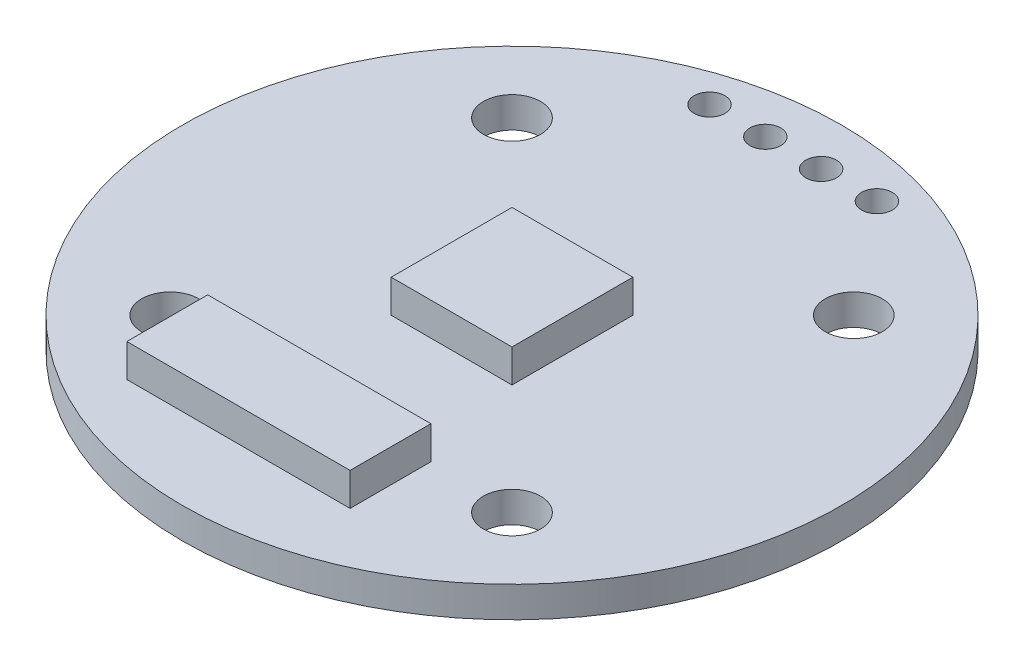
ISO-10303-21;
HEADER;
FILE_DESCRIPTION(('STEP AP214'),'2;1');
FILE_NAME('part.step','',(''),(''),'','','');
FILE_SCHEMA(('AUTOMOTIVE_DESIGN { 1 0 10303 214 1 1 1 1 }'));
ENDSEC;
DATA;
#1=APPLICATION_CONTEXT('core data for automotive mechanical design processes');
#2=APPLICATION_PROTOCOL_DEFINITION('international standard','automotive_design',2000,#1);
#3=PRODUCT_CONTEXT('',#1,'mechanical');
#4=PRODUCT('Part','Part','',(#3));
#5=PRODUCT_RELATED_PRODUCT_CATEGORY('part','',(#4));
#6=PRODUCT_DEFINITION_FORMATION('','',#4);
#7=PRODUCT_DEFINITION_CONTEXT('part definition',#1,'design');
#8=PRODUCT_DEFINITION('design','',#6,#7);
#9=PRODUCT_DEFINITION_SHAPE('','',#8);
#10=(LENGTH_UNIT() NAMED_UNIT(*) SI_UNIT(.MILLI.,.METRE.));
#11=(NAMED_UNIT(*) PLANE_ANGLE_UNIT() SI_UNIT($,.RADIAN.));
#12=(NAMED_UNIT(*) SI_UNIT($,.STERADIAN.) SOLID_ANGLE_UNIT());
#13=UNCERTAINTY_MEASURE_WITH_UNIT(LENGTH_MEASURE(1.E-05),#10,'distance_accuracy_value','');
#14=(GEOMETRIC_REPRESENTATION_CONTEXT(3) GLOBAL_UNCERTAINTY_ASSIGNED_CONTEXT((#13)) GLOBAL_UNIT_ASSIGNED_CONTEXT((#10,
#11,#12)) REPRESENTATION_CONTEXT('',''));
#15=CARTESIAN_POINT('',(0.,0.,0.));
#16=DIRECTION('',(0.,0.,1.));
#17=DIRECTION('',(1.,0.,0.));
#18=AXIS2_PLACEMENT_3D('',#15,#16,#17);
#19=CARTESIAN_POINT('',(7.77817459305198,1.4,-7.77817459305251));
#20=DIRECTION('',(0.,-1.,0.));
#21=DIRECTION('',(0.,0.,-1.));
#22=AXIS2_PLACEMENT_3D('',#19,#20,#21);
#23=CYLINDRICAL_SURFACE('',#22,1.3);
#24=CARTESIAN_POINT('',(7.77817459305198,1.4,-7.77817459305251));
#25=DIRECTION('',(0.,1.,0.));
#26=DIRECTION('',(0.,0.,1.));
#27=AXIS2_PLACEMENT_3D('',#24,#25,#26);
#28=CIRCLE('',#27,1.3);
#29=CARTESIAN_POINT('',(7.77817459305198,1.4,-6.47817459305251));
#30=VERTEX_POINT('',#29);
#31=EDGE_CURVE('E48',#30,#30,#28,.T.);
#32=ORIENTED_EDGE('',*,*,#31,.T.);
#33=EDGE_LOOP('',(#32));
#34=FACE_BOUND('',#33,.T.);
#35=CARTESIAN_POINT('',(7.77817459305198,0.,-7.77817459305251));
#36=DIRECTION('',(0.,1.,0.));
#37=DIRECTION('',(0.,0.,1.));
#38=AXIS2_PLACEMENT_3D('',#35,#36,#37);
#39=CIRCLE('',#38,1.3);
#40=CARTESIAN_POINT('',(7.77817459305198,0.,-6.47817459305251));
#41=VERTEX_POINT('',#40);
#42=EDGE_CURVE('E269',#41,#41,#39,.T.);
#43=ORIENTED_EDGE('',*,*,#42,.F.);
#44=EDGE_LOOP('',(#43));
#45=FACE_BOUND('',#44,.T.);
#46=ADVANCED_FACE('F39',(#34,#45),#23,.F.);
#47=CARTESIAN_POINT('',(7.77817459305251,1.4,7.77817459305153));
#48=DIRECTION('',(0.,-1.,0.));
#49=DIRECTION('',(0.,0.,-1.));
#50=AXIS2_PLACEMENT_3D('',#47,#48,#49);
#51=CYLINDRICAL_SURFACE('',#50,1.3);
#52=CARTESIAN_POINT('',(7.77817459305251,1.4,7.77817459305153));
#53=DIRECTION('',(0.,1.,0.));
#54=DIRECTION('',(0.,0.,1.));
#55=AXIS2_PLACEMENT_3D('',#52,#53,#54);
#56=CIRCLE('',#55,1.3);
#57=CARTESIAN_POINT('',(7.77817459305251,1.4,9.07817459305153));
#58=VERTEX_POINT('',#57);
#59=EDGE_CURVE('E245',#58,#58,#56,.T.);
#60=ORIENTED_EDGE('',*,*,#59,.T.);
#61=EDGE_LOOP('',(#60));
#62=FACE_BOUND('',#61,.T.);
#63=CARTESIAN_POINT('',(7.77817459305251,0.,7.77817459305153));
#64=DIRECTION('',(0.,1.,0.));
#65=DIRECTION('',(0.,0.,1.));
#66=AXIS2_PLACEMENT_3D('',#63,#64,#65);
#67=CIRCLE('',#66,1.3);
#68=CARTESIAN_POINT('',(7.77817459305251,0.,9.07817459305153));
#69=VERTEX_POINT('',#68);
#70=EDGE_CURVE('E267',#69,#69,#67,.T.);
#71=ORIENTED_EDGE('',*,*,#70,.F.);
#72=EDGE_LOOP('',(#71));
#73=FACE_BOUND('',#72,.T.);
#74=ADVANCED_FACE('F295',(#62,#73),#51,.F.);
#75=CARTESIAN_POINT('',(-7.77817459305153,1.4,7.77817459305207));
#76=DIRECTION('',(0.,-1.,0.));
#77=DIRECTION('',(0.,0.,-1.));
#78=AXIS2_PLACEMENT_3D('',#75,#76,#77);
#79=CYLINDRICAL_SURFACE('',#78,1.3);
#80=CARTESIAN_POINT('',(-7.77817459305153,1.4,7.77817459305207));
#81=DIRECTION('',(0.,1.,0.));
#82=DIRECTION('',(0.,0.,1.));
#83=AXIS2_PLACEMENT_3D('',#80,#81,#82);
#84=CIRCLE('',#83,1.3);
#85=CARTESIAN_POINT('',(-7.77817459305153,1.4,9.07817459305207));
#86=VERTEX_POINT('',#85);
#87=EDGE_CURVE('E242',#86,#86,#84,.T.);
#88=ORIENTED_EDGE('',*,*,#87,.T.);
#89=EDGE_LOOP('',(#88));
#90=FACE_BOUND('',#89,.T.);
#91=CARTESIAN_POINT('',(-7.77817459305153,0.,7.77817459305207));
#92=DIRECTION('',(0.,1.,0.));
#93=DIRECTION('',(0.,0.,1.));
#94=AXIS2_PLACEMENT_3D('',#91,#92,#93);
#95=CIRCLE('',#94,1.3);
#96=CARTESIAN_POINT('',(-7.77817459305153,0.,9.07817459305207));
#97=VERTEX_POINT('',#96);
#98=EDGE_CURVE('E264',#97,#97,#95,.T.);
#99=ORIENTED_EDGE('',*,*,#98,.F.);
#100=EDGE_LOOP('',(#99));
#101=FACE_BOUND('',#100,.T.);
#102=ADVANCED_FACE('F301',(#90,#101),#79,.F.);
#103=CARTESIAN_POINT('',(-3.81,1.4,-12.8));
#104=DIRECTION('',(0.,-1.,0.));
#105=DIRECTION('',(0.,0.,-1.));
#106=AXIS2_PLACEMENT_3D('',#103,#104,#105);
#107=CYLINDRICAL_SURFACE('',#106,0.699999999999999);
#108=CARTESIAN_POINT('',(-3.81,1.4,-12.8));
#109=DIRECTION('',(0.,1.,0.));
#110=DIRECTION('',(0.,0.,1.));
#111=AXIS2_PLACEMENT_3D('',#108,#109,#110);
#112=CIRCLE('',#111,0.699999999999999);
#113=CARTESIAN_POINT('',(-3.81,1.4,-12.1));
#114=VERTEX_POINT('',#113);
#115=EDGE_CURVE('E239',#114,#114,#112,.T.);
#116=ORIENTED_EDGE('',*,*,#115,.T.);
#117=EDGE_LOOP('',(#116));
#118=FACE_BOUND('',#117,.T.);
#119=CARTESIAN_POINT('',(-3.81,0.,-12.8));
#120=DIRECTION('',(0.,1.,0.));
#121=DIRECTION('',(0.,0.,1.));
#122=AXIS2_PLACEMENT_3D('',#119,#120,#121);
#123=CIRCLE('',#122,0.699999999999999);
#124=CARTESIAN_POINT('',(-3.81,0.,-12.1));
#125=VERTEX_POINT('',#124);
#126=EDGE_CURVE('E261',#125,#125,#123,.T.);
#127=ORIENTED_EDGE('',*,*,#126,.F.);
#128=EDGE_LOOP('',(#127));
#129=FACE_BOUND('',#128,.T.);
#130=ADVANCED_FACE('F308',(#118,#129),#107,.F.);
#131=CARTESIAN_POINT('',(-1.27,1.4,-12.8));
#132=DIRECTION('',(0.,-1.,0.));
#133=DIRECTION('',(0.,0.,-1.));
#134=AXIS2_PLACEMENT_3D('',#131,#132,#133);
#135=CYLINDRICAL_SURFACE('',#134,0.699999999999999);
#136=CARTESIAN_POINT('',(-1.27,1.4,-12.8));
#137=DIRECTION('',(0.,1.,0.));
#138=DIRECTION('',(0.,0.,1.));
#139=AXIS2_PLACEMENT_3D('',#136,#137,#138);
#140=CIRCLE('',#139,0.699999999999999);
#141=CARTESIAN_POINT('',(-1.27,1.4,-12.1));
#142=VERTEX_POINT('',#141);
#143=EDGE_CURVE('E236',#142,#142,#140,.T.);
#144=ORIENTED_EDGE('',*,*,#143,.T.);
#145=EDGE_LOOP('',(#144));
#146=FACE_BOUND('',#145,.T.);
#147=CARTESIAN_POINT('',(-1.27,0.,-12.8));
#148=DIRECTION('',(0.,1.,0.));
#149=DIRECTION('',(0.,0.,1.));
#150=AXIS2_PLACEMENT_3D('',#147,#148,#149);
#151=CIRCLE('',#150,0.699999999999999);
#152=CARTESIAN_POINT('',(-1.27,0.,-12.1));
#153=VERTEX_POINT('',#152);
#154=EDGE_CURVE('E258',#153,#153,#151,.T.);
#155=ORIENTED_EDGE('',*,*,#154,.F.);
#156=EDGE_LOOP('',(#155));
#157=FACE_BOUND('',#156,.T.);
#158=ADVANCED_FACE('F312',(#146,#157),#135,.F.);
#159=CARTESIAN_POINT('',(1.27,1.4,-12.8));
#160=DIRECTION('',(0.,-1.,0.));
#161=DIRECTION('',(0.,0.,-1.));
#162=AXIS2_PLACEMENT_3D('',#159,#160,#161);
#163=CYLINDRICAL_SURFACE('',#162,0.699999999999999);
#164=CARTESIAN_POINT('',(1.27,1.4,-12.8));
#165=DIRECTION('',(0.,1.,0.));
#166=DIRECTION('',(0.,0.,1.));
#167=AXIS2_PLACEMENT_3D('',#164,#165,#166);
#168=CIRCLE('',#167,0.699999999999999);
#169=CARTESIAN_POINT('',(1.27,1.4,-12.1));
#170=VERTEX_POINT('',#169);
#171=EDGE_CURVE('E233',#170,#170,#168,.T.);
#172=ORIENTED_EDGE('',*,*,#171,.T.);
#173=EDGE_LOOP('',(#172));
#174=FACE_BOUND('',#173,.T.);
#175=CARTESIAN_POINT('',(1.27,0.,-12.8));
#176=DIRECTION('',(0.,1.,0.));
#177=DIRECTION('',(0.,0.,1.));
#178=AXIS2_PLACEMENT_3D('',#175,#176,#177);
#179=CIRCLE('',#178,0.699999999999999);
#180=CARTESIAN_POINT('',(1.27,0.,-12.1));
#181=VERTEX_POINT('',#180);
#182=EDGE_CURVE('E255',#181,#181,#179,.T.);
#183=ORIENTED_EDGE('',*,*,#182,.F.);
#184=EDGE_LOOP('',(#183));
#185=FACE_BOUND('',#184,.T.);
#186=ADVANCED_FACE('F316',(#174,#185),#163,.F.);
#187=CARTESIAN_POINT('',(3.81,1.4,-12.8));
#188=DIRECTION('',(0.,-1.,0.));
#189=DIRECTION('',(0.,0.,-1.));
#190=AXIS2_PLACEMENT_3D('',#187,#188,#189);
#191=CYLINDRICAL_SURFACE('',#190,0.699999999999999);
#192=CARTESIAN_POINT('',(3.81,1.4,-12.8));
#193=DIRECTION('',(0.,1.,0.));
#194=DIRECTION('',(0.,0.,1.));
#195=AXIS2_PLACEMENT_3D('',#192,#193,#194);
#196=CIRCLE('',#195,0.699999999999999);
#197=CARTESIAN_POINT('',(3.81,1.4,-12.1));
#198=VERTEX_POINT('',#197);
#199=EDGE_CURVE('E230',#198,#198,#196,.T.);
#200=ORIENTED_EDGE('',*,*,#199,.T.);
#201=EDGE_LOOP('',(#200));
#202=FACE_BOUND('',#201,.T.);
#203=CARTESIAN_POINT('',(3.81,0.,-12.8));
#204=DIRECTION('',(0.,1.,0.));
#205=DIRECTION('',(0.,0.,1.));
#206=AXIS2_PLACEMENT_3D('',#203,#204,#205);
#207=CIRCLE('',#206,0.699999999999999);
#208=CARTESIAN_POINT('',(3.81,0.,-12.1));
#209=VERTEX_POINT('',#208);
#210=EDGE_CURVE('E252',#209,#209,#207,.T.);
#211=ORIENTED_EDGE('',*,*,#210,.F.);
#212=EDGE_LOOP('',(#211));
#213=FACE_BOUND('',#212,.T.);
#214=ADVANCED_FACE('F319',(#202,#213),#191,.F.);
#215=CARTESIAN_POINT('',(-7.77817459305206,1.4,-7.77817459305198));
#216=DIRECTION('',(0.,-1.,0.));
#217=DIRECTION('',(0.,0.,-1.));
#218=AXIS2_PLACEMENT_3D('',#215,#216,#217);
#219=CYLINDRICAL_SURFACE('',#218,1.3);
#220=CARTESIAN_POINT('',(-7.77817459305206,1.4,-7.77817459305198));
#221=DIRECTION('',(0.,1.,0.));
#222=DIRECTION('',(0.,0.,1.));
#223=AXIS2_PLACEMENT_3D('',#220,#221,#222);
#224=CIRCLE('',#223,1.3);
#225=CARTESIAN_POINT('',(-7.77817459305206,1.4,-6.47817459305198));
#226=VERTEX_POINT('',#225);
#227=EDGE_CURVE('E227',#226,#226,#224,.T.);
#228=ORIENTED_EDGE('',*,*,#227,.T.);
#229=EDGE_LOOP('',(#228));
#230=FACE_BOUND('',#229,.T.);
#231=CARTESIAN_POINT('',(-7.77817459305206,0.,-7.77817459305198));
#232=DIRECTION('',(0.,1.,0.));
#233=DIRECTION('',(0.,0.,1.));
#234=AXIS2_PLACEMENT_3D('',#231,#232,#233);
#235=CIRCLE('',#234,1.3);
#236=CARTESIAN_POINT('',(-7.77817459305206,0.,-6.47817459305198));
#237=VERTEX_POINT('',#236);
#238=EDGE_CURVE('E226',#237,#237,#235,.T.);
#239=ORIENTED_EDGE('',*,*,#238,.F.);
#240=EDGE_LOOP('',(#239));
#241=FACE_BOUND('',#240,.T.);
#242=ADVANCED_FACE('F41',(#230,#241),#219,.F.);
#243=CARTESIAN_POINT('',(0.,1.4,0.));
#244=DIRECTION('',(0.,-1.,0.));
#245=DIRECTION('',(0.,0.,-1.));
#246=AXIS2_PLACEMENT_3D('',#243,#244,#245);
#247=CYLINDRICAL_SURFACE('',#246,15.);
#248=CARTESIAN_POINT('',(0.,1.4,0.));
#249=DIRECTION('',(0.,1.,0.));
#250=DIRECTION('',(0.,0.,1.));
#251=AXIS2_PLACEMENT_3D('',#248,#249,#250);
#252=CIRCLE('',#251,15.);
#253=CARTESIAN_POINT('',(0.,1.4,15.));
#254=VERTEX_POINT('',#253);
#255=EDGE_CURVE('E11',#254,#254,#252,.T.);
#256=ORIENTED_EDGE('',*,*,#255,.F.);
#257=EDGE_LOOP('',(#256));
#258=FACE_BOUND('',#257,.T.);
#259=CARTESIAN_POINT('',(0.,0.,0.));
#260=DIRECTION('',(0.,1.,0.));
#261=DIRECTION('',(0.,0.,1.));
#262=AXIS2_PLACEMENT_3D('',#259,#260,#261);
#263=CIRCLE('',#262,15.);
#264=CARTESIAN_POINT('',(0.,0.,15.));
#265=VERTEX_POINT('',#264);
#266=EDGE_CURVE('E43',#265,#265,#263,.T.);
#267=ORIENTED_EDGE('',*,*,#266,.T.);
#268=EDGE_LOOP('',(#267));
#269=FACE_BOUND('',#268,.T.);
#270=ADVANCED_FACE('F276',(#258,#269),#247,.T.);
#271=CARTESIAN_POINT('',(0.,1.4,0.));
#272=DIRECTION('',(0.,1.,0.));
#273=DIRECTION('',(0.,0.,1.));
#274=AXIS2_PLACEMENT_3D('',#271,#272,#273);
#275=PLANE('',#274);
#276=DIRECTION('',(0.,0.,1.));
#277=VECTOR('',#276,1.);
#278=CARTESIAN_POINT('',(3.93,1.4,0.));
#279=LINE('',#278,#277);
#280=CARTESIAN_POINT('',(3.93,1.4,7.62));
#281=VERTEX_POINT('',#280);
#282=CARTESIAN_POINT('',(3.93,1.4,11.3));
#283=VERTEX_POINT('',#282);
#284=EDGE_CURVE('E137',#281,#283,#279,.T.);
#285=ORIENTED_EDGE('',*,*,#284,.T.);
#286=DIRECTION('',(1.,0.,0.));
#287=VECTOR('',#286,1.);
#288=CARTESIAN_POINT('',(0.,1.4,11.3));
#289=LINE('',#288,#287);
#290=CARTESIAN_POINT('',(-6.23,1.4,11.3));
#291=VERTEX_POINT('',#290);
#292=EDGE_CURVE('E171',#291,#283,#289,.T.);
#293=ORIENTED_EDGE('',*,*,#292,.F.);
#294=DIRECTION('',(0.,0.,1.));
#295=VECTOR('',#294,1.);
#296=CARTESIAN_POINT('',(-6.23,1.4,0.));
#297=LINE('',#296,#295);
#298=CARTESIAN_POINT('',(-6.23,1.4,7.62));
#299=VERTEX_POINT('',#298);
#300=EDGE_CURVE('E184',#299,#291,#297,.T.);
#301=ORIENTED_EDGE('',*,*,#300,.F.);
#302=DIRECTION('',(1.,0.,0.));
#303=VECTOR('',#302,1.);
#304=CARTESIAN_POINT('',(0.,1.4,7.62));
#305=LINE('',#304,#303);
#306=EDGE_CURVE('E181',#299,#281,#305,.T.);
#307=ORIENTED_EDGE('',*,*,#306,.T.);
#308=EDGE_LOOP('',(#285,#293,#301,#307));
#309=FACE_BOUND('',#308,.T.);
#310=DIRECTION('',(0.,0.,-1.));
#311=VECTOR('',#310,1.);
#312=CARTESIAN_POINT('',(-2.75,1.4,0.));
#313=LINE('',#312,#311);
#314=CARTESIAN_POINT('',(-2.75,1.4,2.75));
#315=VERTEX_POINT('',#314);
#316=CARTESIAN_POINT('',(-2.75,1.4,-2.75));
#317=VERTEX_POINT('',#316);
#318=EDGE_CURVE('E196',#315,#317,#313,.T.);
#319=ORIENTED_EDGE('',*,*,#318,.T.);
#320=DIRECTION('',(-1.,0.,0.));
#321=VECTOR('',#320,1.);
#322=CARTESIAN_POINT('',(0.,1.4,-2.75));
#323=LINE('',#322,#321);
#324=CARTESIAN_POINT('',(2.75,1.4,-2.75));
#325=VERTEX_POINT('',#324);
#326=EDGE_CURVE('E201',#325,#317,#323,.T.);
#327=ORIENTED_EDGE('',*,*,#326,.F.);
#328=DIRECTION('',(0.,0.,-1.));
#329=VECTOR('',#328,1.);
#330=CARTESIAN_POINT('',(2.75,1.4,0.));
#331=LINE('',#330,#329);
#332=CARTESIAN_POINT('',(2.75,1.4,2.75));
#333=VERTEX_POINT('',#332);
#334=EDGE_CURVE('E214',#333,#325,#331,.T.);
#335=ORIENTED_EDGE('',*,*,#334,.F.);
#336=DIRECTION('',(-1.,0.,0.));
#337=VECTOR('',#336,1.);
#338=CARTESIAN_POINT('',(0.,1.4,2.75));
#339=LINE('',#338,#337);
#340=EDGE_CURVE('E211',#333,#315,#339,.T.);
#341=ORIENTED_EDGE('',*,*,#340,.T.);
#342=EDGE_LOOP('',(#319,#327,#335,#341));
#343=FACE_BOUND('',#342,.T.);
#344=ORIENTED_EDGE('',*,*,#227,.F.);
#345=EDGE_LOOP('',(#344));
#346=FACE_BOUND('',#345,.T.);
#347=ORIENTED_EDGE('',*,*,#199,.F.);
#348=EDGE_LOOP('',(#347));
#349=FACE_BOUND('',#348,.T.);
#350=ORIENTED_EDGE('',*,*,#171,.F.);
#351=EDGE_LOOP('',(#350));
#352=FACE_BOUND('',#351,.T.);
#353=ORIENTED_EDGE('',*,*,#143,.F.);
#354=EDGE_LOOP('',(#353));
#355=FACE_BOUND('',#354,.T.);
#356=ORIENTED_EDGE('',*,*,#115,.F.);
#357=EDGE_LOOP('',(#356));
#358=FACE_BOUND('',#357,.T.);
#359=ORIENTED_EDGE('',*,*,#87,.F.);
#360=EDGE_LOOP('',(#359));
#361=FACE_BOUND('',#360,.T.);
#362=ORIENTED_EDGE('',*,*,#59,.F.);
#363=EDGE_LOOP('',(#362));
#364=FACE_BOUND('',#363,.T.);
#365=ORIENTED_EDGE('',*,*,#31,.F.);
#366=EDGE_LOOP('',(#365));
#367=FACE_BOUND('',#366,.T.);
#368=ORIENTED_EDGE('',*,*,#255,.T.);
#369=EDGE_LOOP('',(#368));
#370=FACE_BOUND('',#369,.T.);
#371=ADVANCED_FACE('F281',(#309,#343,#346,#349,#352,#355,#358,#361,#364,#367,#370),#275,.T.);
#372=CARTESIAN_POINT('',(0.,0.,0.));
#373=DIRECTION('',(0.,1.,0.));
#374=DIRECTION('',(0.,0.,1.));
#375=AXIS2_PLACEMENT_3D('',#372,#373,#374);
#376=PLANE('',#375);
#377=DIRECTION('',(-1.,0.,0.));
#378=VECTOR('',#377,1.);
#379=CARTESIAN_POINT('',(0.,0.,-1.685));
#380=LINE('',#379,#378);
#381=CARTESIAN_POINT('',(2.5,0.,-1.685));
#382=VERTEX_POINT('',#381);
#383=CARTESIAN_POINT('',(-2.5,0.,-1.685));
#384=VERTEX_POINT('',#383);
#385=EDGE_CURVE('E56',#382,#384,#380,.T.);
#386=ORIENTED_EDGE('',*,*,#385,.T.);
#387=DIRECTION('',(0.,0.,1.));
#388=VECTOR('',#387,1.);
#389=CARTESIAN_POINT('',(-2.5,0.,0.));
#390=LINE('',#389,#388);
#391=CARTESIAN_POINT('',(-2.5,0.,1.685));
#392=VERTEX_POINT('',#391);
#393=EDGE_CURVE('E134',#384,#392,#390,.T.);
#394=ORIENTED_EDGE('',*,*,#393,.T.);
#395=DIRECTION('',(-1.,0.,0.));
#396=VECTOR('',#395,1.);
#397=CARTESIAN_POINT('',(0.,0.,1.685));
#398=LINE('',#397,#396);
#399=CARTESIAN_POINT('',(2.5,0.,1.685));
#400=VERTEX_POINT('',#399);
#401=EDGE_CURVE('E147',#400,#392,#398,.T.);
#402=ORIENTED_EDGE('',*,*,#401,.F.);
#403=DIRECTION('',(0.,0.,1.));
#404=VECTOR('',#403,1.);
#405=CARTESIAN_POINT('',(2.5,0.,0.));
#406=LINE('',#405,#404);
#407=EDGE_CURVE('E61',#382,#400,#406,.T.);
#408=ORIENTED_EDGE('',*,*,#407,.F.);
#409=EDGE_LOOP('',(#386,#394,#402,#408));
#410=FACE_BOUND('',#409,.T.);
#411=ORIENTED_EDGE('',*,*,#238,.T.);
#412=EDGE_LOOP('',(#411));
#413=FACE_BOUND('',#412,.T.);
#414=ORIENTED_EDGE('',*,*,#210,.T.);
#415=EDGE_LOOP('',(#414));
#416=FACE_BOUND('',#415,.T.);
#417=ORIENTED_EDGE('',*,*,#182,.T.);
#418=EDGE_LOOP('',(#417));
#419=FACE_BOUND('',#418,.T.);
#420=ORIENTED_EDGE('',*,*,#154,.T.);
#421=EDGE_LOOP('',(#420));
#422=FACE_BOUND('',#421,.T.);
#423=ORIENTED_EDGE('',*,*,#126,.T.);
#424=EDGE_LOOP('',(#423));
#425=FACE_BOUND('',#424,.T.);
#426=ORIENTED_EDGE('',*,*,#98,.T.);
#427=EDGE_LOOP('',(#426));
#428=FACE_BOUND('',#427,.T.);
#429=ORIENTED_EDGE('',*,*,#70,.T.);
#430=EDGE_LOOP('',(#429));
#431=FACE_BOUND('',#430,.T.);
#432=ORIENTED_EDGE('',*,*,#42,.T.);
#433=EDGE_LOOP('',(#432));
#434=FACE_BOUND('',#433,.T.);
#435=ORIENTED_EDGE('',*,*,#266,.F.);
#436=EDGE_LOOP('',(#435));
#437=FACE_BOUND('',#436,.T.);
#438=ADVANCED_FACE('F278',(#410,#413,#416,#419,#422,#425,#428,#431,#434,#437),#376,.F.);
#439=CARTESIAN_POINT('',(-2.75,2.9,0.));
#440=DIRECTION('',(-1.,0.,0.));
#441=DIRECTION('',(0.,0.,1.));
#442=AXIS2_PLACEMENT_3D('',#439,#440,#441);
#443=PLANE('',#442);
#444=ORIENTED_EDGE('',*,*,#318,.F.);
#445=DIRECTION('',(0.,-1.,0.));
#446=VECTOR('',#445,1.);
#447=CARTESIAN_POINT('',(-2.75,2.9,2.75));
#448=LINE('',#447,#446);
#449=CARTESIAN_POINT('',(-2.75,2.9,2.75));
#450=VERTEX_POINT('',#449);
#451=EDGE_CURVE('E224',#450,#315,#448,.T.);
#452=ORIENTED_EDGE('',*,*,#451,.F.);
#453=DIRECTION('',(0.,0.,-1.));
#454=VECTOR('',#453,1.);
#455=CARTESIAN_POINT('',(-2.75,2.9,0.));
#456=LINE('',#455,#454);
#457=CARTESIAN_POINT('',(-2.75,2.9,-2.75));
#458=VERTEX_POINT('',#457);
#459=EDGE_CURVE('E197',#450,#458,#456,.T.);
#460=ORIENTED_EDGE('',*,*,#459,.T.);
#461=DIRECTION('',(0.,-1.,0.));
#462=VECTOR('',#461,1.);
#463=CARTESIAN_POINT('',(-2.75,2.9,-2.75));
#464=LINE('',#463,#462);
#465=EDGE_CURVE('E208',#458,#317,#464,.T.);
#466=ORIENTED_EDGE('',*,*,#465,.T.);
#467=EDGE_LOOP('',(#444,#452,#460,#466));
#468=FACE_BOUND('',#467,.T.);
#469=ADVANCED_FACE('F280',(#468),#443,.T.);
#470=CARTESIAN_POINT('',(0.,2.9,2.75));
#471=DIRECTION('',(0.,0.,1.));
#472=DIRECTION('',(1.,0.,0.));
#473=AXIS2_PLACEMENT_3D('',#470,#471,#472);
#474=PLANE('',#473);
#475=ORIENTED_EDGE('',*,*,#340,.F.);
#476=DIRECTION('',(0.,-1.,0.));
#477=VECTOR('',#476,1.);
#478=CARTESIAN_POINT('',(2.75,2.9,2.75));
#479=LINE('',#478,#477);
#480=CARTESIAN_POINT('',(2.75,2.9,2.75));
#481=VERTEX_POINT('',#480);
#482=EDGE_CURVE('E222',#481,#333,#479,.T.);
#483=ORIENTED_EDGE('',*,*,#482,.F.);
#484=DIRECTION('',(-1.,0.,0.));
#485=VECTOR('',#484,1.);
#486=CARTESIAN_POINT('',(0.,2.9,2.75));
#487=LINE('',#486,#485);
#488=EDGE_CURVE('E200',#481,#450,#487,.T.);
#489=ORIENTED_EDGE('',*,*,#488,.T.);
#490=ORIENTED_EDGE('',*,*,#451,.T.);
#491=EDGE_LOOP('',(#475,#483,#489,#490));
#492=FACE_BOUND('',#491,.T.);
#493=ADVANCED_FACE('F287',(#492),#474,.T.);
#494=CARTESIAN_POINT('',(2.75,2.9,0.));
#495=DIRECTION('',(-1.,0.,0.));
#496=DIRECTION('',(0.,0.,1.));
#497=AXIS2_PLACEMENT_3D('',#494,#495,#496);
#498=PLANE('',#497);
#499=ORIENTED_EDGE('',*,*,#334,.T.);
#500=DIRECTION('',(0.,-1.,0.));
#501=VECTOR('',#500,1.);
#502=CARTESIAN_POINT('',(2.75,2.9,-2.75));
#503=LINE('',#502,#501);
#504=CARTESIAN_POINT('',(2.75,2.9,-2.75));
#505=VERTEX_POINT('',#504);
#506=EDGE_CURVE('E220',#505,#325,#503,.T.);
#507=ORIENTED_EDGE('',*,*,#506,.F.);
#508=DIRECTION('',(0.,0.,-1.));
#509=VECTOR('',#508,1.);
#510=CARTESIAN_POINT('',(2.75,2.9,0.));
#511=LINE('',#510,#509);
#512=EDGE_CURVE('E204',#481,#505,#511,.T.);
#513=ORIENTED_EDGE('',*,*,#512,.F.);
#514=ORIENTED_EDGE('',*,*,#482,.T.);
#515=EDGE_LOOP('',(#499,#507,#513,#514));
#516=FACE_BOUND('',#515,.T.);
#517=ADVANCED_FACE('F507',(#516),#498,.F.);
#518=CARTESIAN_POINT('',(0.,2.9,-2.75));
#519=DIRECTION('',(0.,0.,1.));
#520=DIRECTION('',(1.,0.,0.));
#521=AXIS2_PLACEMENT_3D('',#518,#519,#520);
#522=PLANE('',#521);
#523=ORIENTED_EDGE('',*,*,#326,.T.);
#524=ORIENTED_EDGE('',*,*,#465,.F.);
#525=DIRECTION('',(-1.,0.,0.));
#526=VECTOR('',#525,1.);
#527=CARTESIAN_POINT('',(0.,2.9,-2.75));
#528=LINE('',#527,#526);
#529=EDGE_CURVE('E206',#505,#458,#528,.T.);
#530=ORIENTED_EDGE('',*,*,#529,.F.);
#531=ORIENTED_EDGE('',*,*,#506,.T.);
#532=EDGE_LOOP('',(#523,#524,#530,#531));
#533=FACE_BOUND('',#532,.T.);
#534=ADVANCED_FACE('F496',(#533),#522,.F.);
#535=CARTESIAN_POINT('',(0.,2.9,0.));
#536=DIRECTION('',(0.,1.,0.));
#537=DIRECTION('',(0.,0.,1.));
#538=AXIS2_PLACEMENT_3D('',#535,#536,#537);
#539=PLANE('',#538);
#540=ORIENTED_EDGE('',*,*,#459,.F.);
#541=ORIENTED_EDGE('',*,*,#488,.F.);
#542=ORIENTED_EDGE('',*,*,#512,.T.);
#543=ORIENTED_EDGE('',*,*,#529,.T.);
#544=EDGE_LOOP('',(#540,#541,#542,#543));
#545=FACE_BOUND('',#544,.T.);
#546=ADVANCED_FACE('F485',(#545),#539,.T.);
#547=CARTESIAN_POINT('',(3.93,2.9,0.));
#548=DIRECTION('',(1.,0.,0.));
#549=DIRECTION('',(0.,0.,-1.));
#550=AXIS2_PLACEMENT_3D('',#547,#548,#549);
#551=PLANE('',#550);
#552=ORIENTED_EDGE('',*,*,#284,.F.);
#553=DIRECTION('',(0.,-1.,0.));
#554=VECTOR('',#553,1.);
#555=CARTESIAN_POINT('',(3.93,2.9,7.62));
#556=LINE('',#555,#554);
#557=CARTESIAN_POINT('',(3.93,2.9,7.62));
#558=VERTEX_POINT('',#557);
#559=EDGE_CURVE('E194',#558,#281,#556,.T.);
#560=ORIENTED_EDGE('',*,*,#559,.F.);
#561=DIRECTION('',(0.,0.,1.));
#562=VECTOR('',#561,1.);
#563=CARTESIAN_POINT('',(3.93,2.9,0.));
#564=LINE('',#563,#562);
#565=CARTESIAN_POINT('',(3.93,2.9,11.3));
#566=VERTEX_POINT('',#565);
#567=EDGE_CURVE('E167',#558,#566,#564,.T.);
#568=ORIENTED_EDGE('',*,*,#567,.T.);
#569=DIRECTION('',(0.,-1.,0.));
#570=VECTOR('',#569,1.);
#571=CARTESIAN_POINT('',(3.93,2.9,11.3));
#572=LINE('',#571,#570);
#573=EDGE_CURVE('E178',#566,#283,#572,.T.);
#574=ORIENTED_EDGE('',*,*,#573,.T.);
#575=EDGE_LOOP('',(#552,#560,#568,#574));
#576=FACE_BOUND('',#575,.T.);
#577=ADVANCED_FACE('F474',(#576),#551,.T.);
#578=CARTESIAN_POINT('',(0.,2.9,7.62));
#579=DIRECTION('',(0.,0.,-1.));
#580=DIRECTION('',(-1.,0.,0.));
#581=AXIS2_PLACEMENT_3D('',#578,#579,#580);
#582=PLANE('',#581);
#583=ORIENTED_EDGE('',*,*,#306,.F.);
#584=DIRECTION('',(0.,-1.,0.));
#585=VECTOR('',#584,1.);
#586=CARTESIAN_POINT('',(-6.23,2.9,7.62));
#587=LINE('',#586,#585);
#588=CARTESIAN_POINT('',(-6.23,2.9,7.62));
#589=VERTEX_POINT('',#588);
#590=EDGE_CURVE('E192',#589,#299,#587,.T.);
#591=ORIENTED_EDGE('',*,*,#590,.F.);
#592=DIRECTION('',(1.,0.,0.));
#593=VECTOR('',#592,1.);
#594=CARTESIAN_POINT('',(0.,2.9,7.62));
#595=LINE('',#594,#593);
#596=EDGE_CURVE('E170',#589,#558,#595,.T.);
#597=ORIENTED_EDGE('',*,*,#596,.T.);
#598=ORIENTED_EDGE('',*,*,#559,.T.);
#599=EDGE_LOOP('',(#583,#591,#597,#598));
#600=FACE_BOUND('',#599,.T.);
#601=ADVANCED_FACE('F463',(#600),#582,.T.);
#602=CARTESIAN_POINT('',(-6.23,2.9,0.));
#603=DIRECTION('',(1.,0.,0.));
#604=DIRECTION('',(0.,0.,-1.));
#605=AXIS2_PLACEMENT_3D('',#602,#603,#604);
#606=PLANE('',#605);
#607=ORIENTED_EDGE('',*,*,#300,.T.);
#608=DIRECTION('',(0.,-1.,0.));
#609=VECTOR('',#608,1.);
#610=CARTESIAN_POINT('',(-6.23,2.9,11.3));
#611=LINE('',#610,#609);
#612=CARTESIAN_POINT('',(-6.23,2.9,11.3));
#613=VERTEX_POINT('',#612);
#614=EDGE_CURVE('E190',#613,#291,#611,.T.);
#615=ORIENTED_EDGE('',*,*,#614,.F.);
#616=DIRECTION('',(0.,0.,1.));
#617=VECTOR('',#616,1.);
#618=CARTESIAN_POINT('',(-6.23,2.9,0.));
#619=LINE('',#618,#617);
#620=EDGE_CURVE('E174',#589,#613,#619,.T.);
#621=ORIENTED_EDGE('',*,*,#620,.F.);
#622=ORIENTED_EDGE('',*,*,#590,.T.);
#623=EDGE_LOOP('',(#607,#615,#621,#622));
#624=FACE_BOUND('',#623,.T.);
#625=ADVANCED_FACE('F451',(#624),#606,.F.);
#626=CARTESIAN_POINT('',(0.,2.9,11.3));
#627=DIRECTION('',(0.,0.,-1.));
#628=DIRECTION('',(-1.,0.,0.));
#629=AXIS2_PLACEMENT_3D('',#626,#627,#628);
#630=PLANE('',#629);
#631=ORIENTED_EDGE('',*,*,#292,.T.);
#632=ORIENTED_EDGE('',*,*,#573,.F.);
#633=DIRECTION('',(1.,0.,0.));
#634=VECTOR('',#633,1.);
#635=CARTESIAN_POINT('',(0.,2.9,11.3));
#636=LINE('',#635,#634);
#637=EDGE_CURVE('E176',#613,#566,#636,.T.);
#638=ORIENTED_EDGE('',*,*,#637,.F.);
#639=ORIENTED_EDGE('',*,*,#614,.T.);
#640=EDGE_LOOP('',(#631,#632,#638,#639));
#641=FACE_BOUND('',#640,.T.);
#642=ADVANCED_FACE('F439',(#641),#630,.F.);
#643=CARTESIAN_POINT('',(0.,2.9,0.));
#644=DIRECTION('',(0.,1.,0.));
#645=DIRECTION('',(0.,0.,1.));
#646=AXIS2_PLACEMENT_3D('',#643,#644,#645);
#647=PLANE('',#646);
#648=ORIENTED_EDGE('',*,*,#567,.F.);
#649=ORIENTED_EDGE('',*,*,#596,.F.);
#650=ORIENTED_EDGE('',*,*,#620,.T.);
#651=ORIENTED_EDGE('',*,*,#637,.T.);
#652=EDGE_LOOP('',(#648,#649,#650,#651));
#653=FACE_BOUND('',#652,.T.);
#654=ADVANCED_FACE('F421',(#653),#647,.T.);
#655=CARTESIAN_POINT('',(-2.5,-1.5,0.));
#656=DIRECTION('',(-1.,0.,0.));
#657=DIRECTION('',(0.,0.,1.));
#658=AXIS2_PLACEMENT_3D('',#655,#656,#657);
#659=PLANE('',#658);
#660=ORIENTED_EDGE('',*,*,#393,.F.);
#661=DIRECTION('',(0.,1.,0.));
#662=VECTOR('',#661,1.);
#663=CARTESIAN_POINT('',(-2.5,-1.5,-1.685));
#664=LINE('',#663,#662);
#665=CARTESIAN_POINT('',(-2.5,-1.5,-1.685));
#666=VERTEX_POINT('',#665);
#667=EDGE_CURVE('E129',#666,#384,#664,.T.);
#668=ORIENTED_EDGE('',*,*,#667,.F.);
#669=DIRECTION('',(0.,0.,1.));
#670=VECTOR('',#669,1.);
#671=CARTESIAN_POINT('',(-2.5,-1.5,0.));
#672=LINE('',#671,#670);
#673=CARTESIAN_POINT('',(-2.5,-1.5,1.685));
#674=VERTEX_POINT('',#673);
#675=EDGE_CURVE('E133',#666,#674,#672,.T.);
#676=ORIENTED_EDGE('',*,*,#675,.T.);
#677=DIRECTION('',(0.,1.,0.));
#678=VECTOR('',#677,1.);
#679=CARTESIAN_POINT('',(-2.5,-1.5,1.685));
#680=LINE('',#679,#678);
#681=EDGE_CURVE('E156',#674,#392,#680,.T.);
#682=ORIENTED_EDGE('',*,*,#681,.T.);
#683=EDGE_LOOP('',(#660,#668,#676,#682));
#684=FACE_BOUND('',#683,.T.);
#685=ADVANCED_FACE('F131',(#684),#659,.T.);
#686=CARTESIAN_POINT('',(0.,-1.5,-1.685));
#687=DIRECTION('',(0.,0.,-1.));
#688=DIRECTION('',(-1.,0.,0.));
#689=AXIS2_PLACEMENT_3D('',#686,#687,#688);
#690=PLANE('',#689);
#691=ORIENTED_EDGE('',*,*,#385,.F.);
#692=DIRECTION('',(0.,1.,0.));
#693=VECTOR('',#692,1.);
#694=CARTESIAN_POINT('',(2.5,-1.5,-1.685));
#695=LINE('',#694,#693);
#696=CARTESIAN_POINT('',(2.5,-1.5,-1.685));
#697=VERTEX_POINT('',#696);
#698=EDGE_CURVE('E138',#697,#382,#695,.T.);
#699=ORIENTED_EDGE('',*,*,#698,.F.);
#700=DIRECTION('',(-1.,0.,0.));
#701=VECTOR('',#700,1.);
#702=CARTESIAN_POINT('',(0.,-1.5,-1.685));
#703=LINE('',#702,#701);
#704=EDGE_CURVE('E143',#697,#666,#703,.T.);
#705=ORIENTED_EDGE('',*,*,#704,.T.);
#706=ORIENTED_EDGE('',*,*,#667,.T.);
#707=EDGE_LOOP('',(#691,#699,#705,#706));
#708=FACE_BOUND('',#707,.T.);
#709=ADVANCED_FACE('F149',(#708),#690,.T.);
#710=CARTESIAN_POINT('',(2.5,-1.5,0.));
#711=DIRECTION('',(-1.,0.,0.));
#712=DIRECTION('',(0.,0.,1.));
#713=AXIS2_PLACEMENT_3D('',#710,#711,#712);
#714=PLANE('',#713);
#715=ORIENTED_EDGE('',*,*,#407,.T.);
#716=DIRECTION('',(0.,1.,0.));
#717=VECTOR('',#716,1.);
#718=CARTESIAN_POINT('',(2.5,-1.5,1.685));
#719=LINE('',#718,#717);
#720=CARTESIAN_POINT('',(2.5,-1.5,1.685));
#721=VERTEX_POINT('',#720);
#722=EDGE_CURVE('E163',#721,#400,#719,.T.);
#723=ORIENTED_EDGE('',*,*,#722,.F.);
#724=DIRECTION('',(0.,0.,1.));
#725=VECTOR('',#724,1.);
#726=CARTESIAN_POINT('',(2.5,-1.5,0.));
#727=LINE('',#726,#725);
#728=EDGE_CURVE('E151',#697,#721,#727,.T.);
#729=ORIENTED_EDGE('',*,*,#728,.F.);
#730=ORIENTED_EDGE('',*,*,#698,.T.);
#731=EDGE_LOOP('',(#715,#723,#729,#730));
#732=FACE_BOUND('',#731,.T.);
#733=ADVANCED_FACE('F397',(#732),#714,.F.);
#734=CARTESIAN_POINT('',(0.,-1.5,1.685));
#735=DIRECTION('',(0.,0.,-1.));
#736=DIRECTION('',(-1.,0.,0.));
#737=AXIS2_PLACEMENT_3D('',#734,#735,#736);
#738=PLANE('',#737);
#739=ORIENTED_EDGE('',*,*,#401,.T.);
#740=ORIENTED_EDGE('',*,*,#681,.F.);
#741=DIRECTION('',(-1.,0.,0.));
#742=VECTOR('',#741,1.);
#743=CARTESIAN_POINT('',(0.,-1.5,1.685));
#744=LINE('',#743,#742);
#745=EDGE_CURVE('E145',#721,#674,#744,.T.);
#746=ORIENTED_EDGE('',*,*,#745,.F.);
#747=ORIENTED_EDGE('',*,*,#722,.T.);
#748=EDGE_LOOP('',(#739,#740,#746,#747));
#749=FACE_BOUND('',#748,.T.);
#750=ADVANCED_FACE('F386',(#749),#738,.F.);
#751=CARTESIAN_POINT('',(0.,-1.5,0.));
#752=DIRECTION('',(0.,-1.,0.));
#753=DIRECTION('',(0.,0.,-1.));
#754=AXIS2_PLACEMENT_3D('',#751,#752,#753);
#755=PLANE('',#754);
#756=ORIENTED_EDGE('',*,*,#675,.F.);
#757=ORIENTED_EDGE('',*,*,#704,.F.);
#758=ORIENTED_EDGE('',*,*,#728,.T.);
#759=ORIENTED_EDGE('',*,*,#745,.T.);
#760=EDGE_LOOP('',(#756,#757,#758,#759));
#761=FACE_BOUND('',#760,.T.);
#762=ADVANCED_FACE('F142',(#761),#755,.T.);
#763=CLOSED_SHELL('',(#46,#74,#102,#130,#158,#186,#214,#242,#270,#371,#438,#469,#493,#517,#534,
#546,#577,#601,#625,#642,#654,#685,#709,#733,#750,#762));
#764=MANIFOLD_SOLID_BREP('B2',#763);
#765=ADVANCED_BREP_SHAPE_REPRESENTATION('',(#18,#764),#14);
#766=SHAPE_DEFINITION_REPRESENTATION(#9,#765);
ENDSEC;
END-ISO-10303-21;
